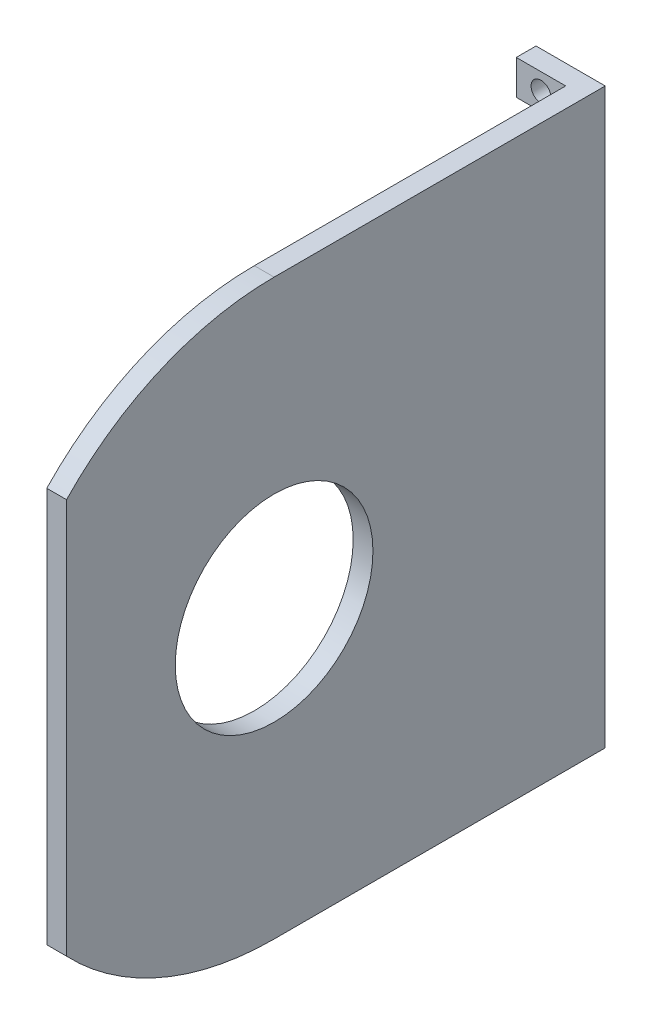
ISO-10303-21;
HEADER;
FILE_DESCRIPTION(('STEP AP214'),'2;1');
FILE_NAME('part.step','',(''),(''),'','','');
FILE_SCHEMA(('AUTOMOTIVE_DESIGN { 1 0 10303 214 1 1 1 1 }'));
ENDSEC;
DATA;
#1=APPLICATION_CONTEXT('core data for automotive mechanical design processes');
#2=APPLICATION_PROTOCOL_DEFINITION('international standard','automotive_design',2000,#1);
#3=PRODUCT_CONTEXT('',#1,'mechanical');
#4=PRODUCT('Part','Part','',(#3));
#5=PRODUCT_RELATED_PRODUCT_CATEGORY('part','',(#4));
#6=PRODUCT_DEFINITION_FORMATION('','',#4);
#7=PRODUCT_DEFINITION_CONTEXT('part definition',#1,'design');
#8=PRODUCT_DEFINITION('design','',#6,#7);
#9=PRODUCT_DEFINITION_SHAPE('','',#8);
#10=(LENGTH_UNIT() NAMED_UNIT(*) SI_UNIT(.MILLI.,.METRE.));
#11=(NAMED_UNIT(*) PLANE_ANGLE_UNIT() SI_UNIT($,.RADIAN.));
#12=(NAMED_UNIT(*) SI_UNIT($,.STERADIAN.) SOLID_ANGLE_UNIT());
#13=UNCERTAINTY_MEASURE_WITH_UNIT(LENGTH_MEASURE(1.E-05),#10,'distance_accuracy_value','');
#14=(GEOMETRIC_REPRESENTATION_CONTEXT(3) GLOBAL_UNCERTAINTY_ASSIGNED_CONTEXT((#13)) GLOBAL_UNIT_ASSIGNED_CONTEXT((#10,
#11,#12)) REPRESENTATION_CONTEXT('',''));
#15=CARTESIAN_POINT('',(0.,0.,0.));
#16=DIRECTION('',(0.,0.,1.));
#17=DIRECTION('',(1.,0.,0.));
#18=AXIS2_PLACEMENT_3D('',#15,#16,#17);
#19=CARTESIAN_POINT('',(4.,0.,4.5));
#20=DIRECTION('',(-1.,0.,0.));
#21=DIRECTION('',(0.,0.,1.));
#22=AXIS2_PLACEMENT_3D('',#19,#20,#21);
#23=CYLINDRICAL_SURFACE('',#22,58.);
#24=CARTESIAN_POINT('',(4.,0.,4.5));
#25=DIRECTION('',(1.,0.,0.));
#26=DIRECTION('',(0.,0.,-1.));
#27=AXIS2_PLACEMENT_3D('',#24,#25,#26);
#28=CIRCLE('',#27,58.);
#29=CARTESIAN_POINT('',(4.,-40.,46.5));
#30=VERTEX_POINT('',#29);
#31=CARTESIAN_POINT('',(4.,-58.,4.50000000000001));
#32=VERTEX_POINT('',#31);
#33=EDGE_CURVE('E141',#30,#32,#28,.T.);
#34=ORIENTED_EDGE('',*,*,#33,.F.);
#35=DIRECTION('',(-1.,0.,0.));
#36=VECTOR('',#35,1.);
#37=CARTESIAN_POINT('',(4.,-40.,46.5));
#38=LINE('',#37,#36);
#39=CARTESIAN_POINT('',(0.,-40.,46.5));
#40=VERTEX_POINT('',#39);
#41=EDGE_CURVE('E11',#30,#40,#38,.T.);
#42=ORIENTED_EDGE('',*,*,#41,.T.);
#43=CARTESIAN_POINT('',(0.,0.,4.5));
#44=DIRECTION('',(1.,0.,0.));
#45=DIRECTION('',(0.,0.,-1.));
#46=AXIS2_PLACEMENT_3D('',#43,#44,#45);
#47=CIRCLE('',#46,58.);
#48=CARTESIAN_POINT('',(0.,-58.,4.50000000000001));
#49=VERTEX_POINT('',#48);
#50=EDGE_CURVE('E162',#40,#49,#47,.T.);
#51=ORIENTED_EDGE('',*,*,#50,.T.);
#52=DIRECTION('',(-1.,0.,0.));
#53=VECTOR('',#52,1.);
#54=CARTESIAN_POINT('',(4.,-58.,4.50000000000001));
#55=LINE('',#54,#53);
#56=EDGE_CURVE('E147',#32,#49,#55,.T.);
#57=ORIENTED_EDGE('',*,*,#56,.F.);
#58=EDGE_LOOP('',(#34,#42,#51,#57));
#59=FACE_BOUND('',#58,.T.);
#60=ADVANCED_FACE('F43',(#59),#23,.T.);
#61=CARTESIAN_POINT('',(4.,0.,4.5));
#62=DIRECTION('',(1.,0.,0.));
#63=DIRECTION('',(0.,0.,-1.));
#64=AXIS2_PLACEMENT_3D('',#61,#62,#63);
#65=PLANE('',#64);
#66=DIRECTION('',(0.,1.,0.));
#67=VECTOR('',#66,1.);
#68=CARTESIAN_POINT('',(4.,40.,46.5));
#69=LINE('',#68,#67);
#70=CARTESIAN_POINT('',(4.,40.,46.5));
#71=VERTEX_POINT('',#70);
#72=EDGE_CURVE('E58',#30,#71,#69,.T.);
#73=ORIENTED_EDGE('',*,*,#72,.F.);
#74=ORIENTED_EDGE('',*,*,#33,.T.);
#75=DIRECTION('',(0.,0.,-1.));
#76=VECTOR('',#75,1.);
#77=CARTESIAN_POINT('',(4.,-58.,-62.5));
#78=LINE('',#77,#76);
#79=CARTESIAN_POINT('',(4.,-58.,-62.5));
#80=VERTEX_POINT('',#79);
#81=EDGE_CURVE('E151',#32,#80,#78,.T.);
#82=ORIENTED_EDGE('',*,*,#81,.T.);
#83=DIRECTION('',(0.,1.,0.));
#84=VECTOR('',#83,1.);
#85=CARTESIAN_POINT('',(4.,-58.,-62.5));
#86=LINE('',#85,#84);
#87=CARTESIAN_POINT('',(4.,58.,-62.5));
#88=VERTEX_POINT('',#87);
#89=EDGE_CURVE('E152',#80,#88,#86,.T.);
#90=ORIENTED_EDGE('',*,*,#89,.T.);
#91=DIRECTION('',(0.,0.,1.));
#92=VECTOR('',#91,1.);
#93=CARTESIAN_POINT('',(4.,58.,-62.5));
#94=LINE('',#93,#92);
#95=CARTESIAN_POINT('',(4.,58.,4.5));
#96=VERTEX_POINT('',#95);
#97=EDGE_CURVE('E149',#88,#96,#94,.T.);
#98=ORIENTED_EDGE('',*,*,#97,.T.);
#99=EDGE_CURVE('E144',#96,#71,#28,.T.);
#100=ORIENTED_EDGE('',*,*,#99,.T.);
#101=EDGE_LOOP('',(#73,#74,#82,#90,#98,#100));
#102=FACE_BOUND('',#101,.T.);
#103=CARTESIAN_POINT('',(4.,0.,4.5));
#104=DIRECTION('',(-1.,0.,0.));
#105=DIRECTION('',(0.,0.,1.));
#106=AXIS2_PLACEMENT_3D('',#103,#104,#105);
#107=CIRCLE('',#106,20.);
#108=CARTESIAN_POINT('',(4.,0.,24.5));
#109=VERTEX_POINT('',#108);
#110=EDGE_CURVE('E185',#109,#109,#107,.T.);
#111=ORIENTED_EDGE('',*,*,#110,.T.);
#112=EDGE_LOOP('',(#111));
#113=FACE_BOUND('',#112,.T.);
#114=ADVANCED_FACE('F139',(#102,#113),#65,.T.);
#115=CARTESIAN_POINT('',(0.,0.,4.5));
#116=DIRECTION('',(1.,0.,0.));
#117=DIRECTION('',(0.,0.,-1.));
#118=AXIS2_PLACEMENT_3D('',#115,#116,#117);
#119=PLANE('',#118);
#120=CARTESIAN_POINT('',(0.,0.,4.5));
#121=DIRECTION('',(-1.,0.,0.));
#122=DIRECTION('',(0.,0.,1.));
#123=AXIS2_PLACEMENT_3D('',#120,#121,#122);
#124=CIRCLE('',#123,20.);
#125=CARTESIAN_POINT('',(0.,0.,24.5));
#126=VERTEX_POINT('',#125);
#127=EDGE_CURVE('E182',#126,#126,#124,.T.);
#128=ORIENTED_EDGE('',*,*,#127,.F.);
#129=EDGE_LOOP('',(#128));
#130=FACE_BOUND('',#129,.T.);
#131=ORIENTED_EDGE('',*,*,#50,.F.);
#132=DIRECTION('',(0.,1.,0.));
#133=VECTOR('',#132,1.);
#134=CARTESIAN_POINT('',(0.,0.,46.5));
#135=LINE('',#134,#133);
#136=CARTESIAN_POINT('',(0.,40.,46.5));
#137=VERTEX_POINT('',#136);
#138=EDGE_CURVE('E133',#40,#137,#135,.T.);
#139=ORIENTED_EDGE('',*,*,#138,.T.);
#140=CARTESIAN_POINT('',(0.,58.,4.5));
#141=VERTEX_POINT('',#140);
#142=EDGE_CURVE('E163',#141,#137,#47,.T.);
#143=ORIENTED_EDGE('',*,*,#142,.F.);
#144=DIRECTION('',(0.,0.,1.));
#145=VECTOR('',#144,1.);
#146=CARTESIAN_POINT('',(0.,58.,-62.5));
#147=LINE('',#146,#145);
#148=CARTESIAN_POINT('',(0.,58.,-58.5));
#149=VERTEX_POINT('',#148);
#150=EDGE_CURVE('E159',#149,#141,#147,.T.);
#151=ORIENTED_EDGE('',*,*,#150,.F.);
#152=DIRECTION('',(0.,-1.,0.));
#153=VECTOR('',#152,1.);
#154=CARTESIAN_POINT('',(0.,58.,-58.5));
#155=LINE('',#154,#153);
#156=CARTESIAN_POINT('',(0.,51.,-58.5));
#157=VERTEX_POINT('',#156);
#158=EDGE_CURVE('E227',#149,#157,#155,.T.);
#159=ORIENTED_EDGE('',*,*,#158,.T.);
#160=DIRECTION('',(0.,0.,-1.));
#161=VECTOR('',#160,1.);
#162=CARTESIAN_POINT('',(0.,51.,-58.5));
#163=LINE('',#162,#161);
#164=CARTESIAN_POINT('',(0.,51.,-62.5));
#165=VERTEX_POINT('',#164);
#166=EDGE_CURVE('E240',#157,#165,#163,.T.);
#167=ORIENTED_EDGE('',*,*,#166,.T.);
#168=DIRECTION('',(0.,1.,0.));
#169=VECTOR('',#168,1.);
#170=CARTESIAN_POINT('',(0.,-58.,-62.5));
#171=LINE('',#170,#169);
#172=CARTESIAN_POINT('',(0.,-51.,-62.5));
#173=VERTEX_POINT('',#172);
#174=EDGE_CURVE('E66',#173,#165,#171,.T.);
#175=ORIENTED_EDGE('',*,*,#174,.F.);
#176=DIRECTION('',(0.,0.,-1.));
#177=VECTOR('',#176,1.);
#178=CARTESIAN_POINT('',(0.,-51.,-58.5));
#179=LINE('',#178,#177);
#180=CARTESIAN_POINT('',(0.,-51.,-58.5));
#181=VERTEX_POINT('',#180);
#182=EDGE_CURVE('E189',#181,#173,#179,.T.);
#183=ORIENTED_EDGE('',*,*,#182,.F.);
#184=DIRECTION('',(0.,-1.,0.));
#185=VECTOR('',#184,1.);
#186=CARTESIAN_POINT('',(0.,-58.,-58.5));
#187=LINE('',#186,#185);
#188=CARTESIAN_POINT('',(0.,-58.,-58.5));
#189=VERTEX_POINT('',#188);
#190=EDGE_CURVE('E201',#181,#189,#187,.T.);
#191=ORIENTED_EDGE('',*,*,#190,.T.);
#192=DIRECTION('',(0.,0.,-1.));
#193=VECTOR('',#192,1.);
#194=CARTESIAN_POINT('',(0.,-58.,-62.5));
#195=LINE('',#194,#193);
#196=EDGE_CURVE('E166',#49,#189,#195,.T.);
#197=ORIENTED_EDGE('',*,*,#196,.F.);
#198=EDGE_LOOP('',(#131,#139,#143,#151,#159,#167,#175,#183,#191,#197));
#199=FACE_BOUND('',#198,.T.);
#200=ADVANCED_FACE('F179',(#130,#199),#119,.F.);
#201=CARTESIAN_POINT('',(4.,-58.,-62.5));
#202=DIRECTION('',(0.,0.,1.));
#203=DIRECTION('',(1.,0.,0.));
#204=AXIS2_PLACEMENT_3D('',#201,#202,#203);
#205=PLANE('',#204);
#206=DIRECTION('',(-1.,0.,0.));
#207=VECTOR('',#206,1.);
#208=CARTESIAN_POINT('',(4.,-58.,-62.5));
#209=LINE('',#208,#207);
#210=CARTESIAN_POINT('',(-10.,-58.,-62.5));
#211=VERTEX_POINT('',#210);
#212=EDGE_CURVE('E157',#80,#211,#209,.T.);
#213=ORIENTED_EDGE('',*,*,#212,.T.);
#214=DIRECTION('',(0.,1.,0.));
#215=VECTOR('',#214,1.);
#216=CARTESIAN_POINT('',(-10.,-58.,-62.5));
#217=LINE('',#216,#215);
#218=CARTESIAN_POINT('',(-10.,-51.,-62.5));
#219=VERTEX_POINT('',#218);
#220=EDGE_CURVE('E200',#211,#219,#217,.T.);
#221=ORIENTED_EDGE('',*,*,#220,.T.);
#222=DIRECTION('',(1.,0.,0.));
#223=VECTOR('',#222,1.);
#224=CARTESIAN_POINT('',(0.,-51.,-62.5));
#225=LINE('',#224,#223);
#226=EDGE_CURVE('E198',#219,#173,#225,.T.);
#227=ORIENTED_EDGE('',*,*,#226,.T.);
#228=ORIENTED_EDGE('',*,*,#174,.T.);
#229=DIRECTION('',(-1.,0.,0.));
#230=VECTOR('',#229,1.);
#231=CARTESIAN_POINT('',(0.,51.,-62.5));
#232=LINE('',#231,#230);
#233=CARTESIAN_POINT('',(-10.,51.,-62.5));
#234=VERTEX_POINT('',#233);
#235=EDGE_CURVE('E224',#165,#234,#232,.T.);
#236=ORIENTED_EDGE('',*,*,#235,.T.);
#237=DIRECTION('',(0.,1.,0.));
#238=VECTOR('',#237,1.);
#239=CARTESIAN_POINT('',(-10.,58.,-62.5));
#240=LINE('',#239,#238);
#241=CARTESIAN_POINT('',(-10.,58.,-62.5));
#242=VERTEX_POINT('',#241);
#243=EDGE_CURVE('E231',#234,#242,#240,.T.);
#244=ORIENTED_EDGE('',*,*,#243,.T.);
#245=DIRECTION('',(-1.,0.,0.));
#246=VECTOR('',#245,1.);
#247=CARTESIAN_POINT('',(4.,58.,-62.5));
#248=LINE('',#247,#246);
#249=EDGE_CURVE('E174',#88,#242,#248,.T.);
#250=ORIENTED_EDGE('',*,*,#249,.F.);
#251=ORIENTED_EDGE('',*,*,#89,.F.);
#252=EDGE_LOOP('',(#213,#221,#227,#228,#236,#244,#250,#251));
#253=FACE_BOUND('',#252,.T.);
#254=CARTESIAN_POINT('',(-5.,54.5,-62.5));
#255=DIRECTION('',(0.,0.,-1.));
#256=DIRECTION('',(-1.,0.,0.));
#257=AXIS2_PLACEMENT_3D('',#254,#255,#256);
#258=CIRCLE('',#257,2.);
#259=CARTESIAN_POINT('',(-7.,54.5,-62.5));
#260=VERTEX_POINT('',#259);
#261=EDGE_CURVE('E218',#260,#260,#258,.T.);
#262=ORIENTED_EDGE('',*,*,#261,.F.);
#263=EDGE_LOOP('',(#262));
#264=FACE_BOUND('',#263,.T.);
#265=CARTESIAN_POINT('',(-5.,-54.5,-62.5));
#266=DIRECTION('',(0.,0.,-1.));
#267=DIRECTION('',(1.,0.,0.));
#268=AXIS2_PLACEMENT_3D('',#265,#266,#267);
#269=CIRCLE('',#268,2.);
#270=CARTESIAN_POINT('',(-3.,-54.5,-62.5));
#271=VERTEX_POINT('',#270);
#272=EDGE_CURVE('E215',#271,#271,#269,.T.);
#273=ORIENTED_EDGE('',*,*,#272,.F.);
#274=EDGE_LOOP('',(#273));
#275=FACE_BOUND('',#274,.T.);
#276=ADVANCED_FACE('F45',(#253,#264,#275),#205,.F.);
#277=CARTESIAN_POINT('',(4.,58.,-62.5));
#278=DIRECTION('',(0.,-1.,0.));
#279=DIRECTION('',(0.,0.,-1.));
#280=AXIS2_PLACEMENT_3D('',#277,#278,#279);
#281=PLANE('',#280);
#282=ORIENTED_EDGE('',*,*,#249,.T.);
#283=DIRECTION('',(0.,0.,-1.));
#284=VECTOR('',#283,1.);
#285=CARTESIAN_POINT('',(-10.,58.,-58.5));
#286=LINE('',#285,#284);
#287=CARTESIAN_POINT('',(-10.,58.,-58.5));
#288=VERTEX_POINT('',#287);
#289=EDGE_CURVE('E160',#288,#242,#286,.T.);
#290=ORIENTED_EDGE('',*,*,#289,.F.);
#291=DIRECTION('',(1.,0.,0.));
#292=VECTOR('',#291,1.);
#293=CARTESIAN_POINT('',(0.,58.,-58.5));
#294=LINE('',#293,#292);
#295=EDGE_CURVE('E237',#288,#149,#294,.T.);
#296=ORIENTED_EDGE('',*,*,#295,.T.);
#297=ORIENTED_EDGE('',*,*,#150,.T.);
#298=DIRECTION('',(-1.,0.,0.));
#299=VECTOR('',#298,1.);
#300=CARTESIAN_POINT('',(4.,58.,4.5));
#301=LINE('',#300,#299);
#302=EDGE_CURVE('E171',#96,#141,#301,.T.);
#303=ORIENTED_EDGE('',*,*,#302,.F.);
#304=ORIENTED_EDGE('',*,*,#97,.F.);
#305=EDGE_LOOP('',(#282,#290,#296,#297,#303,#304));
#306=FACE_BOUND('',#305,.T.);
#307=ADVANCED_FACE('F257',(#306),#281,.F.);
#308=ORIENTED_EDGE('',*,*,#142,.T.);
#309=DIRECTION('',(-1.,0.,0.));
#310=VECTOR('',#309,1.);
#311=CARTESIAN_POINT('',(4.,40.,46.5));
#312=LINE('',#311,#310);
#313=EDGE_CURVE('E51',#137,#71,#312,.F.);
#314=ORIENTED_EDGE('',*,*,#313,.T.);
#315=ORIENTED_EDGE('',*,*,#99,.F.);
#316=ORIENTED_EDGE('',*,*,#302,.T.);
#317=EDGE_LOOP('',(#308,#314,#315,#316));
#318=FACE_BOUND('',#317,.T.);
#319=ADVANCED_FACE('F176',(#318),#23,.T.);
#320=CARTESIAN_POINT('',(4.,-58.,-62.5));
#321=DIRECTION('',(0.,1.,0.));
#322=DIRECTION('',(0.,0.,1.));
#323=AXIS2_PLACEMENT_3D('',#320,#321,#322);
#324=PLANE('',#323);
#325=ORIENTED_EDGE('',*,*,#196,.T.);
#326=DIRECTION('',(-1.,0.,0.));
#327=VECTOR('',#326,1.);
#328=CARTESIAN_POINT('',(0.,-58.,-58.5));
#329=LINE('',#328,#327);
#330=CARTESIAN_POINT('',(-10.,-58.,-58.5));
#331=VERTEX_POINT('',#330);
#332=EDGE_CURVE('E210',#189,#331,#329,.T.);
#333=ORIENTED_EDGE('',*,*,#332,.T.);
#334=DIRECTION('',(0.,0.,-1.));
#335=VECTOR('',#334,1.);
#336=CARTESIAN_POINT('',(-10.,-58.,-58.5));
#337=LINE('',#336,#335);
#338=EDGE_CURVE('E191',#331,#211,#337,.T.);
#339=ORIENTED_EDGE('',*,*,#338,.T.);
#340=ORIENTED_EDGE('',*,*,#212,.F.);
#341=ORIENTED_EDGE('',*,*,#81,.F.);
#342=ORIENTED_EDGE('',*,*,#56,.T.);
#343=EDGE_LOOP('',(#325,#333,#339,#340,#341,#342));
#344=FACE_BOUND('',#343,.T.);
#345=ADVANCED_FACE('F277',(#344),#324,.F.);
#346=CARTESIAN_POINT('',(-10.,58.,-58.5));
#347=DIRECTION('',(-1.,0.,0.));
#348=DIRECTION('',(0.,0.,1.));
#349=AXIS2_PLACEMENT_3D('',#346,#347,#348);
#350=PLANE('',#349);
#351=ORIENTED_EDGE('',*,*,#243,.F.);
#352=DIRECTION('',(0.,0.,-1.));
#353=VECTOR('',#352,1.);
#354=CARTESIAN_POINT('',(-10.,51.,-58.5));
#355=LINE('',#354,#353);
#356=CARTESIAN_POINT('',(-10.,51.,-58.5));
#357=VERTEX_POINT('',#356);
#358=EDGE_CURVE('E246',#357,#234,#355,.T.);
#359=ORIENTED_EDGE('',*,*,#358,.F.);
#360=DIRECTION('',(0.,1.,0.));
#361=VECTOR('',#360,1.);
#362=CARTESIAN_POINT('',(-10.,58.,-58.5));
#363=LINE('',#362,#361);
#364=EDGE_CURVE('E234',#357,#288,#363,.T.);
#365=ORIENTED_EDGE('',*,*,#364,.T.);
#366=ORIENTED_EDGE('',*,*,#289,.T.);
#367=EDGE_LOOP('',(#351,#359,#365,#366));
#368=FACE_BOUND('',#367,.T.);
#369=ADVANCED_FACE('F259',(#368),#350,.T.);
#370=CARTESIAN_POINT('',(0.,51.,-58.5));
#371=DIRECTION('',(0.,-1.,0.));
#372=DIRECTION('',(0.,0.,-1.));
#373=AXIS2_PLACEMENT_3D('',#370,#371,#372);
#374=PLANE('',#373);
#375=ORIENTED_EDGE('',*,*,#235,.F.);
#376=ORIENTED_EDGE('',*,*,#166,.F.);
#377=DIRECTION('',(-1.,0.,0.));
#378=VECTOR('',#377,1.);
#379=CARTESIAN_POINT('',(0.,51.,-58.5));
#380=LINE('',#379,#378);
#381=EDGE_CURVE('E230',#157,#357,#380,.T.);
#382=ORIENTED_EDGE('',*,*,#381,.T.);
#383=ORIENTED_EDGE('',*,*,#358,.T.);
#384=EDGE_LOOP('',(#375,#376,#382,#383));
#385=FACE_BOUND('',#384,.T.);
#386=ADVANCED_FACE('F267',(#385),#374,.T.);
#387=CARTESIAN_POINT('',(0.,0.,-58.5));
#388=DIRECTION('',(0.,0.,-1.));
#389=DIRECTION('',(-1.,0.,0.));
#390=AXIS2_PLACEMENT_3D('',#387,#388,#389);
#391=PLANE('',#390);
#392=CARTESIAN_POINT('',(-5.,54.5,-58.5));
#393=DIRECTION('',(0.,0.,-1.));
#394=DIRECTION('',(-1.,0.,0.));
#395=AXIS2_PLACEMENT_3D('',#392,#393,#394);
#396=CIRCLE('',#395,2.);
#397=CARTESIAN_POINT('',(-7.,54.5,-58.5));
#398=VERTEX_POINT('',#397);
#399=EDGE_CURVE('E221',#398,#398,#396,.T.);
#400=ORIENTED_EDGE('',*,*,#399,.T.);
#401=EDGE_LOOP('',(#400));
#402=FACE_BOUND('',#401,.T.);
#403=ORIENTED_EDGE('',*,*,#158,.F.);
#404=ORIENTED_EDGE('',*,*,#295,.F.);
#405=ORIENTED_EDGE('',*,*,#364,.F.);
#406=ORIENTED_EDGE('',*,*,#381,.F.);
#407=EDGE_LOOP('',(#403,#404,#405,#406));
#408=FACE_BOUND('',#407,.T.);
#409=ADVANCED_FACE('F264',(#402,#408),#391,.F.);
#410=CARTESIAN_POINT('',(-5.,54.5,-58.5));
#411=DIRECTION('',(0.,0.,-1.));
#412=DIRECTION('',(-1.,0.,0.));
#413=AXIS2_PLACEMENT_3D('',#410,#411,#412);
#414=CYLINDRICAL_SURFACE('',#413,2.);
#415=ORIENTED_EDGE('',*,*,#399,.F.);
#416=EDGE_LOOP('',(#415));
#417=FACE_BOUND('',#416,.T.);
#418=ORIENTED_EDGE('',*,*,#261,.T.);
#419=EDGE_LOOP('',(#418));
#420=FACE_BOUND('',#419,.T.);
#421=ADVANCED_FACE('F274',(#417,#420),#414,.F.);
#422=CARTESIAN_POINT('',(0.,-51.,-58.5));
#423=DIRECTION('',(0.,1.,0.));
#424=DIRECTION('',(0.,0.,1.));
#425=AXIS2_PLACEMENT_3D('',#422,#423,#424);
#426=PLANE('',#425);
#427=ORIENTED_EDGE('',*,*,#226,.F.);
#428=DIRECTION('',(0.,0.,-1.));
#429=VECTOR('',#428,1.);
#430=CARTESIAN_POINT('',(-10.,-51.,-58.5));
#431=LINE('',#430,#429);
#432=CARTESIAN_POINT('',(-10.,-51.,-58.5));
#433=VERTEX_POINT('',#432);
#434=EDGE_CURVE('E195',#433,#219,#431,.T.);
#435=ORIENTED_EDGE('',*,*,#434,.F.);
#436=DIRECTION('',(1.,0.,0.));
#437=VECTOR('',#436,1.);
#438=CARTESIAN_POINT('',(0.,-51.,-58.5));
#439=LINE('',#438,#437);
#440=EDGE_CURVE('E194',#433,#181,#439,.T.);
#441=ORIENTED_EDGE('',*,*,#440,.T.);
#442=ORIENTED_EDGE('',*,*,#182,.T.);
#443=EDGE_LOOP('',(#427,#435,#441,#442));
#444=FACE_BOUND('',#443,.T.);
#445=ADVANCED_FACE('F322',(#444),#426,.T.);
#446=CARTESIAN_POINT('',(-10.,-58.,-58.5));
#447=DIRECTION('',(-1.,0.,0.));
#448=DIRECTION('',(0.,0.,1.));
#449=AXIS2_PLACEMENT_3D('',#446,#447,#448);
#450=PLANE('',#449);
#451=ORIENTED_EDGE('',*,*,#220,.F.);
#452=ORIENTED_EDGE('',*,*,#338,.F.);
#453=DIRECTION('',(0.,1.,0.));
#454=VECTOR('',#453,1.);
#455=CARTESIAN_POINT('',(-10.,-58.,-58.5));
#456=LINE('',#455,#454);
#457=EDGE_CURVE('E207',#331,#433,#456,.T.);
#458=ORIENTED_EDGE('',*,*,#457,.T.);
#459=ORIENTED_EDGE('',*,*,#434,.T.);
#460=EDGE_LOOP('',(#451,#452,#458,#459));
#461=FACE_BOUND('',#460,.T.);
#462=ADVANCED_FACE('F319',(#461),#450,.T.);
#463=CARTESIAN_POINT('',(0.,0.,-58.5));
#464=DIRECTION('',(0.,0.,1.));
#465=DIRECTION('',(1.,0.,0.));
#466=AXIS2_PLACEMENT_3D('',#463,#464,#465);
#467=PLANE('',#466);
#468=CARTESIAN_POINT('',(-5.,-54.5,-58.5));
#469=DIRECTION('',(0.,0.,-1.));
#470=DIRECTION('',(1.,0.,0.));
#471=AXIS2_PLACEMENT_3D('',#468,#469,#470);
#472=CIRCLE('',#471,2.);
#473=CARTESIAN_POINT('',(-3.,-54.5,-58.5));
#474=VERTEX_POINT('',#473);
#475=EDGE_CURVE('E204',#474,#474,#472,.T.);
#476=ORIENTED_EDGE('',*,*,#475,.T.);
#477=EDGE_LOOP('',(#476));
#478=FACE_BOUND('',#477,.T.);
#479=ORIENTED_EDGE('',*,*,#190,.F.);
#480=ORIENTED_EDGE('',*,*,#440,.F.);
#481=ORIENTED_EDGE('',*,*,#457,.F.);
#482=ORIENTED_EDGE('',*,*,#332,.F.);
#483=EDGE_LOOP('',(#479,#480,#481,#482));
#484=FACE_BOUND('',#483,.T.);
#485=ADVANCED_FACE('F314',(#478,#484),#467,.T.);
#486=CARTESIAN_POINT('',(-5.,-54.5,-58.5));
#487=DIRECTION('',(0.,0.,-1.));
#488=DIRECTION('',(-1.,0.,0.));
#489=AXIS2_PLACEMENT_3D('',#486,#487,#488);
#490=CYLINDRICAL_SURFACE('',#489,2.);
#491=ORIENTED_EDGE('',*,*,#475,.F.);
#492=EDGE_LOOP('',(#491));
#493=FACE_BOUND('',#492,.T.);
#494=ORIENTED_EDGE('',*,*,#272,.T.);
#495=EDGE_LOOP('',(#494));
#496=FACE_BOUND('',#495,.T.);
#497=ADVANCED_FACE('F307',(#493,#496),#490,.F.);
#498=CARTESIAN_POINT('',(4.,0.,4.5));
#499=DIRECTION('',(-1.,0.,0.));
#500=DIRECTION('',(0.,0.,1.));
#501=AXIS2_PLACEMENT_3D('',#498,#499,#500);
#502=CYLINDRICAL_SURFACE('',#501,20.);
#503=ORIENTED_EDGE('',*,*,#110,.F.);
#504=EDGE_LOOP('',(#503));
#505=FACE_BOUND('',#504,.T.);
#506=ORIENTED_EDGE('',*,*,#127,.T.);
#507=EDGE_LOOP('',(#506));
#508=FACE_BOUND('',#507,.T.);
#509=ADVANCED_FACE('F306',(#505,#508),#502,.F.);
#510=CARTESIAN_POINT('',(-10.,40.,46.5));
#511=DIRECTION('',(0.,0.,-1.));
#512=DIRECTION('',(-1.,0.,0.));
#513=AXIS2_PLACEMENT_3D('',#510,#511,#512);
#514=PLANE('',#513);
#515=ORIENTED_EDGE('',*,*,#41,.F.);
#516=ORIENTED_EDGE('',*,*,#72,.T.);
#517=ORIENTED_EDGE('',*,*,#313,.F.);
#518=ORIENTED_EDGE('',*,*,#138,.F.);
#519=EDGE_LOOP('',(#515,#516,#517,#518));
#520=FACE_BOUND('',#519,.T.);
#521=ADVANCED_FACE('F131',(#520),#514,.F.);
#522=CLOSED_SHELL('',(#60,#114,#200,#276,#307,#319,#345,#369,#386,#409,#421,#445,#462,#485,#497,
#509,#521));
#523=MANIFOLD_SOLID_BREP('B2',#522);
#524=ADVANCED_BREP_SHAPE_REPRESENTATION('',(#18,#523),#14);
#525=SHAPE_DEFINITION_REPRESENTATION(#9,#524);
ENDSEC;
END-ISO-10303-21;
